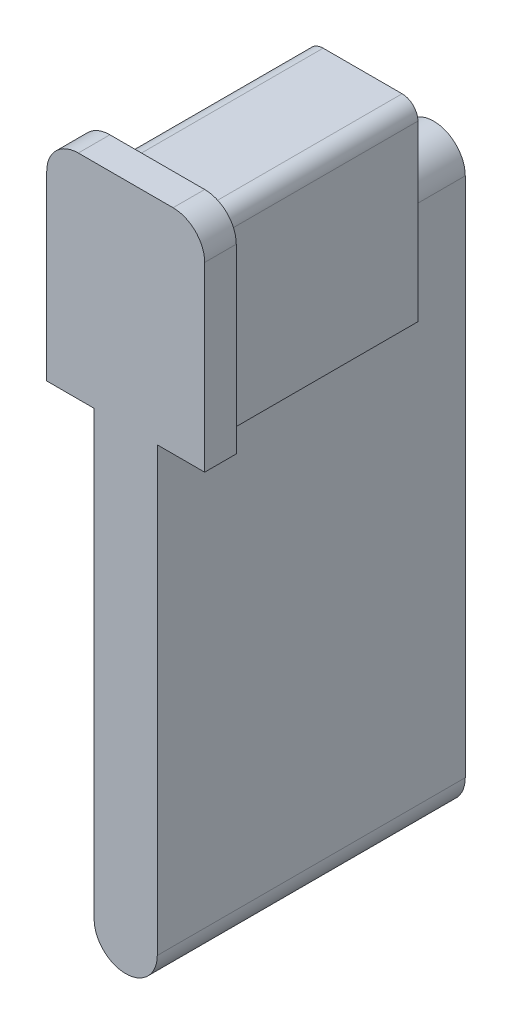
ISO-10303-21;
HEADER;
FILE_DESCRIPTION(('STEP AP214'),'2;1');
FILE_NAME('part.step','',(''),(''),'','','');
FILE_SCHEMA(('AUTOMOTIVE_DESIGN { 1 0 10303 214 1 1 1 1 }'));
ENDSEC;
DATA;
#1=APPLICATION_CONTEXT('core data for automotive mechanical design processes');
#2=APPLICATION_PROTOCOL_DEFINITION('international standard','automotive_design',2000,#1);
#3=PRODUCT_CONTEXT('',#1,'mechanical');
#4=PRODUCT('Part','Part','',(#3));
#5=PRODUCT_RELATED_PRODUCT_CATEGORY('part','',(#4));
#6=PRODUCT_DEFINITION_FORMATION('','',#4);
#7=PRODUCT_DEFINITION_CONTEXT('part definition',#1,'design');
#8=PRODUCT_DEFINITION('design','',#6,#7);
#9=PRODUCT_DEFINITION_SHAPE('','',#8);
#10=(LENGTH_UNIT() NAMED_UNIT(*) SI_UNIT(.MILLI.,.METRE.));
#11=(NAMED_UNIT(*) PLANE_ANGLE_UNIT() SI_UNIT($,.RADIAN.));
#12=(NAMED_UNIT(*) SI_UNIT($,.STERADIAN.) SOLID_ANGLE_UNIT());
#13=UNCERTAINTY_MEASURE_WITH_UNIT(LENGTH_MEASURE(1.E-05),#10,'distance_accuracy_value','');
#14=(GEOMETRIC_REPRESENTATION_CONTEXT(3) GLOBAL_UNCERTAINTY_ASSIGNED_CONTEXT((#13)) GLOBAL_UNIT_ASSIGNED_CONTEXT((#10,
#11,#12)) REPRESENTATION_CONTEXT('',''));
#15=CARTESIAN_POINT('',(0.,0.,0.));
#16=DIRECTION('',(0.,0.,1.));
#17=DIRECTION('',(1.,0.,0.));
#18=AXIS2_PLACEMENT_3D('',#15,#16,#17);
#19=CARTESIAN_POINT('',(-1.5,40.,4.5));
#20=DIRECTION('',(-1.,0.,0.));
#21=DIRECTION('',(0.,0.,1.));
#22=AXIS2_PLACEMENT_3D('',#19,#20,#21);
#23=PLANE('',#22);
#24=DIRECTION('',(0.,0.,1.));
#25=VECTOR('',#24,1.);
#26=CARTESIAN_POINT('',(-1.5,28.,4.5));
#27=LINE('',#26,#25);
#28=CARTESIAN_POINT('',(-1.5,28.,4.5));
#29=VERTEX_POINT('',#28);
#30=CARTESIAN_POINT('',(-1.5,28.,17.5));
#31=VERTEX_POINT('',#30);
#32=EDGE_CURVE('E211',#29,#31,#27,.T.);
#33=ORIENTED_EDGE('',*,*,#32,.T.);
#34=DIRECTION('',(0.,1.,0.));
#35=VECTOR('',#34,1.);
#36=CARTESIAN_POINT('',(-1.5,40.,17.5));
#37=LINE('',#36,#35);
#38=CARTESIAN_POINT('',(-1.5,39.,17.5));
#39=VERTEX_POINT('',#38);
#40=EDGE_CURVE('E192',#31,#39,#37,.T.);
#41=ORIENTED_EDGE('',*,*,#40,.T.);
#42=DIRECTION('',(0.,0.,1.));
#43=VECTOR('',#42,1.);
#44=CARTESIAN_POINT('',(-1.5,39.,4.5));
#45=LINE('',#44,#43);
#46=CARTESIAN_POINT('',(-1.5,39.,4.5));
#47=VERTEX_POINT('',#46);
#48=EDGE_CURVE('E268',#39,#47,#45,.F.);
#49=ORIENTED_EDGE('',*,*,#48,.T.);
#50=DIRECTION('',(0.,-1.,0.));
#51=VECTOR('',#50,1.);
#52=CARTESIAN_POINT('',(-1.5,40.,4.5));
#53=LINE('',#52,#51);
#54=EDGE_CURVE('E176',#47,#29,#53,.T.);
#55=ORIENTED_EDGE('',*,*,#54,.T.);
#56=EDGE_LOOP('',(#33,#41,#49,#55));
#57=FACE_BOUND('',#56,.T.);
#58=ADVANCED_FACE('F33',(#57),#23,.T.);
#59=CARTESIAN_POINT('',(-1.5,40.,4.5));
#60=DIRECTION('',(0.,1.,0.));
#61=DIRECTION('',(0.,0.,1.));
#62=AXIS2_PLACEMENT_3D('',#59,#60,#61);
#63=PLANE('',#62);
#64=DIRECTION('',(0.,0.,1.));
#65=VECTOR('',#64,1.);
#66=CARTESIAN_POINT('',(-0.500000000000002,40.,4.5));
#67=LINE('',#66,#65);
#68=CARTESIAN_POINT('',(-0.500000000000002,40.,4.5));
#69=VERTEX_POINT('',#68);
#70=CARTESIAN_POINT('',(-0.500000000000002,40.,17.5));
#71=VERTEX_POINT('',#70);
#72=EDGE_CURVE('E259',#69,#71,#67,.T.);
#73=ORIENTED_EDGE('',*,*,#72,.T.);
#74=DIRECTION('',(1.,0.,0.));
#75=VECTOR('',#74,1.);
#76=CARTESIAN_POINT('',(-1.5,40.,17.5));
#77=LINE('',#76,#75);
#78=CARTESIAN_POINT('',(4.49999999999999,40.,17.5));
#79=VERTEX_POINT('',#78);
#80=EDGE_CURVE('E185',#71,#79,#77,.T.);
#81=ORIENTED_EDGE('',*,*,#80,.T.);
#82=DIRECTION('',(0.,0.,1.));
#83=VECTOR('',#82,1.);
#84=CARTESIAN_POINT('',(4.49999999999999,40.,4.5));
#85=LINE('',#84,#83);
#86=CARTESIAN_POINT('',(4.49999999999999,40.,4.5));
#87=VERTEX_POINT('',#86);
#88=EDGE_CURVE('E262',#79,#87,#85,.F.);
#89=ORIENTED_EDGE('',*,*,#88,.T.);
#90=DIRECTION('',(-1.,0.,0.));
#91=VECTOR('',#90,1.);
#92=CARTESIAN_POINT('',(-1.5,40.,4.5));
#93=LINE('',#92,#91);
#94=EDGE_CURVE('E208',#87,#69,#93,.T.);
#95=ORIENTED_EDGE('',*,*,#94,.T.);
#96=EDGE_LOOP('',(#73,#81,#89,#95));
#97=FACE_BOUND('',#96,.T.);
#98=ADVANCED_FACE('F322',(#97),#63,.T.);
#99=CARTESIAN_POINT('',(5.49999999999999,40.,4.5));
#100=DIRECTION('',(1.,0.,0.));
#101=DIRECTION('',(0.,0.,-1.));
#102=AXIS2_PLACEMENT_3D('',#99,#100,#101);
#103=PLANE('',#102);
#104=DIRECTION('',(0.,0.,1.));
#105=VECTOR('',#104,1.);
#106=CARTESIAN_POINT('',(5.49999999999999,39.,4.5));
#107=LINE('',#106,#105);
#108=CARTESIAN_POINT('',(5.49999999999999,39.,4.5));
#109=VERTEX_POINT('',#108);
#110=CARTESIAN_POINT('',(5.49999999999999,39.,17.5));
#111=VERTEX_POINT('',#110);
#112=EDGE_CURVE('E256',#109,#111,#107,.T.);
#113=ORIENTED_EDGE('',*,*,#112,.T.);
#114=DIRECTION('',(0.,-1.,0.));
#115=VECTOR('',#114,1.);
#116=CARTESIAN_POINT('',(5.49999999999999,40.,17.5));
#117=LINE('',#116,#115);
#118=CARTESIAN_POINT('',(5.49999999999999,28.,17.5));
#119=VERTEX_POINT('',#118);
#120=EDGE_CURVE('E198',#111,#119,#117,.T.);
#121=ORIENTED_EDGE('',*,*,#120,.T.);
#122=DIRECTION('',(0.,0.,1.));
#123=VECTOR('',#122,1.);
#124=CARTESIAN_POINT('',(5.49999999999999,28.,4.5));
#125=LINE('',#124,#123);
#126=CARTESIAN_POINT('',(5.49999999999999,28.,4.5));
#127=VERTEX_POINT('',#126);
#128=EDGE_CURVE('E212',#127,#119,#125,.T.);
#129=ORIENTED_EDGE('',*,*,#128,.F.);
#130=DIRECTION('',(0.,1.,0.));
#131=VECTOR('',#130,1.);
#132=CARTESIAN_POINT('',(5.49999999999999,40.,4.5));
#133=LINE('',#132,#131);
#134=EDGE_CURVE('E205',#127,#109,#133,.T.);
#135=ORIENTED_EDGE('',*,*,#134,.T.);
#136=EDGE_LOOP('',(#113,#121,#129,#135));
#137=FACE_BOUND('',#136,.T.);
#138=ADVANCED_FACE('F314',(#137),#103,.T.);
#139=CARTESIAN_POINT('',(4.49999999999999,39.,4.5));
#140=DIRECTION('',(0.,0.,1.));
#141=DIRECTION('',(1.,0.,0.));
#142=AXIS2_PLACEMENT_3D('',#139,#140,#141);
#143=CYLINDRICAL_SURFACE('',#142,1.);
#144=ORIENTED_EDGE('',*,*,#88,.F.);
#145=CARTESIAN_POINT('',(4.49999999999999,39.,17.5));
#146=DIRECTION('',(0.,0.,1.));
#147=DIRECTION('',(1.,0.,0.));
#148=AXIS2_PLACEMENT_3D('',#145,#146,#147);
#149=CIRCLE('',#148,1.);
#150=EDGE_CURVE('E195',#79,#111,#149,.F.);
#151=ORIENTED_EDGE('',*,*,#150,.T.);
#152=ORIENTED_EDGE('',*,*,#112,.F.);
#153=CARTESIAN_POINT('',(4.49999999999999,39.,4.5));
#154=DIRECTION('',(0.,0.,1.));
#155=DIRECTION('',(1.,0.,0.));
#156=AXIS2_PLACEMENT_3D('',#153,#154,#155);
#157=CIRCLE('',#156,1.);
#158=EDGE_CURVE('E266',#87,#109,#157,.F.);
#159=ORIENTED_EDGE('',*,*,#158,.F.);
#160=EDGE_LOOP('',(#144,#151,#152,#159));
#161=FACE_BOUND('',#160,.T.);
#162=ADVANCED_FACE('F320',(#161),#143,.T.);
#163=CARTESIAN_POINT('',(-0.500000000000002,39.,4.5));
#164=DIRECTION('',(0.,0.,1.));
#165=DIRECTION('',(1.,0.,0.));
#166=AXIS2_PLACEMENT_3D('',#163,#164,#165);
#167=CYLINDRICAL_SURFACE('',#166,1.);
#168=ORIENTED_EDGE('',*,*,#48,.F.);
#169=CARTESIAN_POINT('',(-0.500000000000002,39.,17.5));
#170=DIRECTION('',(0.,0.,1.));
#171=DIRECTION('',(1.,0.,0.));
#172=AXIS2_PLACEMENT_3D('',#169,#170,#171);
#173=CIRCLE('',#172,1.);
#174=EDGE_CURVE('E270',#39,#71,#173,.F.);
#175=ORIENTED_EDGE('',*,*,#174,.T.);
#176=ORIENTED_EDGE('',*,*,#72,.F.);
#177=CARTESIAN_POINT('',(-0.500000000000002,39.,4.5));
#178=DIRECTION('',(0.,0.,1.));
#179=DIRECTION('',(1.,0.,0.));
#180=AXIS2_PLACEMENT_3D('',#177,#178,#179);
#181=CIRCLE('',#180,1.);
#182=EDGE_CURVE('E264',#47,#69,#181,.F.);
#183=ORIENTED_EDGE('',*,*,#182,.F.);
#184=EDGE_LOOP('',(#168,#175,#176,#183));
#185=FACE_BOUND('',#184,.T.);
#186=ADVANCED_FACE('F328',(#185),#167,.T.);
#187=CARTESIAN_POINT('',(2.,33.,19.5));
#188=DIRECTION('',(0.,0.,-1.));
#189=DIRECTION('',(-1.,0.,0.));
#190=AXIS2_PLACEMENT_3D('',#187,#188,#189);
#191=CYLINDRICAL_SURFACE('',#190,2.);
#192=CARTESIAN_POINT('',(2.,33.,4.5));
#193=DIRECTION('',(0.,0.,1.));
#194=DIRECTION('',(1.,0.,0.));
#195=AXIS2_PLACEMENT_3D('',#192,#193,#194);
#196=CIRCLE('',#195,2.);
#197=CARTESIAN_POINT('',(4.,33.,4.5));
#198=VERTEX_POINT('',#197);
#199=CARTESIAN_POINT('',(0.,33.,4.5));
#200=VERTEX_POINT('',#199);
#201=EDGE_CURVE('E220',#198,#200,#196,.T.);
#202=ORIENTED_EDGE('',*,*,#201,.F.);
#203=DIRECTION('',(0.,0.,-1.));
#204=VECTOR('',#203,1.);
#205=CARTESIAN_POINT('',(4.,33.,19.5));
#206=LINE('',#205,#204);
#207=CARTESIAN_POINT('',(4.,33.,0.));
#208=VERTEX_POINT('',#207);
#209=EDGE_CURVE('E248',#198,#208,#206,.T.);
#210=ORIENTED_EDGE('',*,*,#209,.T.);
#211=CARTESIAN_POINT('',(2.,33.,0.));
#212=DIRECTION('',(0.,0.,1.));
#213=DIRECTION('',(1.,0.,0.));
#214=AXIS2_PLACEMENT_3D('',#211,#212,#213);
#215=CIRCLE('',#214,2.);
#216=CARTESIAN_POINT('',(0.,33.,0.));
#217=VERTEX_POINT('',#216);
#218=EDGE_CURVE('E230',#208,#217,#215,.T.);
#219=ORIENTED_EDGE('',*,*,#218,.T.);
#220=DIRECTION('',(0.,0.,-1.));
#221=VECTOR('',#220,1.);
#222=CARTESIAN_POINT('',(0.,33.,19.5));
#223=LINE('',#222,#221);
#224=EDGE_CURVE('E246',#200,#217,#223,.T.);
#225=ORIENTED_EDGE('',*,*,#224,.F.);
#226=EDGE_LOOP('',(#202,#210,#219,#225));
#227=FACE_BOUND('',#226,.T.);
#228=ADVANCED_FACE('F340',(#227),#191,.T.);
#229=CARTESIAN_POINT('',(2.,0.,19.5));
#230=DIRECTION('',(0.,0.,-1.));
#231=DIRECTION('',(-1.,0.,0.));
#232=AXIS2_PLACEMENT_3D('',#229,#230,#231);
#233=CYLINDRICAL_SURFACE('',#232,2.);
#234=CARTESIAN_POINT('',(2.,0.,0.));
#235=DIRECTION('',(0.,0.,1.));
#236=DIRECTION('',(1.,0.,0.));
#237=AXIS2_PLACEMENT_3D('',#234,#235,#236);
#238=CIRCLE('',#237,2.);
#239=CARTESIAN_POINT('',(0.,0.,0.));
#240=VERTEX_POINT('',#239);
#241=CARTESIAN_POINT('',(4.,0.,0.));
#242=VERTEX_POINT('',#241);
#243=EDGE_CURVE('E224',#240,#242,#238,.T.);
#244=ORIENTED_EDGE('',*,*,#243,.T.);
#245=DIRECTION('',(0.,0.,-1.));
#246=VECTOR('',#245,1.);
#247=CARTESIAN_POINT('',(4.,0.,19.5));
#248=LINE('',#247,#246);
#249=CARTESIAN_POINT('',(4.,0.,19.5));
#250=VERTEX_POINT('',#249);
#251=EDGE_CURVE('E250',#250,#242,#248,.T.);
#252=ORIENTED_EDGE('',*,*,#251,.F.);
#253=CARTESIAN_POINT('',(2.,0.,19.5));
#254=DIRECTION('',(0.,0.,1.));
#255=DIRECTION('',(1.,0.,0.));
#256=AXIS2_PLACEMENT_3D('',#253,#254,#255);
#257=CIRCLE('',#256,2.);
#258=CARTESIAN_POINT('',(0.,0.,19.5));
#259=VERTEX_POINT('',#258);
#260=EDGE_CURVE('E235',#259,#250,#257,.T.);
#261=ORIENTED_EDGE('',*,*,#260,.F.);
#262=DIRECTION('',(0.,0.,-1.));
#263=VECTOR('',#262,1.);
#264=CARTESIAN_POINT('',(0.,0.,19.5));
#265=LINE('',#264,#263);
#266=EDGE_CURVE('E243',#259,#240,#265,.T.);
#267=ORIENTED_EDGE('',*,*,#266,.T.);
#268=EDGE_LOOP('',(#244,#252,#261,#267));
#269=FACE_BOUND('',#268,.T.);
#270=ADVANCED_FACE('F35',(#269),#233,.T.);
#271=CARTESIAN_POINT('',(4.,0.,19.5));
#272=DIRECTION('',(-1.,0.,0.));
#273=DIRECTION('',(0.,0.,1.));
#274=AXIS2_PLACEMENT_3D('',#271,#272,#273);
#275=PLANE('',#274);
#276=DIRECTION('',(0.,1.,0.));
#277=VECTOR('',#276,1.);
#278=CARTESIAN_POINT('',(4.,0.,4.5));
#279=LINE('',#278,#277);
#280=CARTESIAN_POINT('',(4.,28.,4.5));
#281=VERTEX_POINT('',#280);
#282=EDGE_CURVE('E222',#281,#198,#279,.T.);
#283=ORIENTED_EDGE('',*,*,#282,.F.);
#284=DIRECTION('',(0.,0.,1.));
#285=VECTOR('',#284,1.);
#286=CARTESIAN_POINT('',(4.,28.,19.5));
#287=LINE('',#286,#285);
#288=CARTESIAN_POINT('',(4.,28.,19.5));
#289=VERTEX_POINT('',#288);
#290=EDGE_CURVE('E218',#281,#289,#287,.T.);
#291=ORIENTED_EDGE('',*,*,#290,.T.);
#292=DIRECTION('',(0.,1.,0.));
#293=VECTOR('',#292,1.);
#294=CARTESIAN_POINT('',(4.,0.,19.5));
#295=LINE('',#294,#293);
#296=EDGE_CURVE('E238',#250,#289,#295,.T.);
#297=ORIENTED_EDGE('',*,*,#296,.F.);
#298=ORIENTED_EDGE('',*,*,#251,.T.);
#299=DIRECTION('',(0.,1.,0.));
#300=VECTOR('',#299,1.);
#301=CARTESIAN_POINT('',(4.,0.,0.));
#302=LINE('',#301,#300);
#303=EDGE_CURVE('E227',#242,#208,#302,.T.);
#304=ORIENTED_EDGE('',*,*,#303,.T.);
#305=ORIENTED_EDGE('',*,*,#209,.F.);
#306=EDGE_LOOP('',(#283,#291,#297,#298,#304,#305));
#307=FACE_BOUND('',#306,.T.);
#308=ADVANCED_FACE('F353',(#307),#275,.F.);
#309=CARTESIAN_POINT('',(0.,0.,19.5));
#310=DIRECTION('',(1.,0.,0.));
#311=DIRECTION('',(0.,0.,-1.));
#312=AXIS2_PLACEMENT_3D('',#309,#310,#311);
#313=PLANE('',#312);
#314=DIRECTION('',(0.,-1.,0.));
#315=VECTOR('',#314,1.);
#316=CARTESIAN_POINT('',(0.,0.,19.5));
#317=LINE('',#316,#315);
#318=CARTESIAN_POINT('',(0.,28.,19.5));
#319=VERTEX_POINT('',#318);
#320=EDGE_CURVE('E241',#319,#259,#317,.T.);
#321=ORIENTED_EDGE('',*,*,#320,.F.);
#322=DIRECTION('',(0.,0.,-1.));
#323=VECTOR('',#322,1.);
#324=CARTESIAN_POINT('',(0.,28.,19.5));
#325=LINE('',#324,#323);
#326=CARTESIAN_POINT('',(0.,28.,4.5));
#327=VERTEX_POINT('',#326);
#328=EDGE_CURVE('E174',#319,#327,#325,.T.);
#329=ORIENTED_EDGE('',*,*,#328,.T.);
#330=DIRECTION('',(0.,-1.,0.));
#331=VECTOR('',#330,1.);
#332=CARTESIAN_POINT('',(0.,0.,4.5));
#333=LINE('',#332,#331);
#334=EDGE_CURVE('E253',#200,#327,#333,.T.);
#335=ORIENTED_EDGE('',*,*,#334,.F.);
#336=ORIENTED_EDGE('',*,*,#224,.T.);
#337=DIRECTION('',(0.,-1.,0.));
#338=VECTOR('',#337,1.);
#339=CARTESIAN_POINT('',(0.,0.,0.));
#340=LINE('',#339,#338);
#341=EDGE_CURVE('E233',#217,#240,#340,.T.);
#342=ORIENTED_EDGE('',*,*,#341,.T.);
#343=ORIENTED_EDGE('',*,*,#266,.F.);
#344=EDGE_LOOP('',(#321,#329,#335,#336,#342,#343));
#345=FACE_BOUND('',#344,.T.);
#346=ADVANCED_FACE('F338',(#345),#313,.F.);
#347=CARTESIAN_POINT('',(2.,0.,19.5));
#348=DIRECTION('',(0.,0.,1.));
#349=DIRECTION('',(1.,0.,0.));
#350=AXIS2_PLACEMENT_3D('',#347,#348,#349);
#351=PLANE('',#350);
#352=DIRECTION('',(0.,1.,0.));
#353=VECTOR('',#352,1.);
#354=CARTESIAN_POINT('',(7.,41.5,19.5));
#355=LINE('',#354,#353);
#356=CARTESIAN_POINT('',(7.,28.,19.5));
#357=VERTEX_POINT('',#356);
#358=CARTESIAN_POINT('',(7.,39.5,19.5));
#359=VERTEX_POINT('',#358);
#360=EDGE_CURVE('E165',#357,#359,#355,.T.);
#361=ORIENTED_EDGE('',*,*,#360,.T.);
#362=CARTESIAN_POINT('',(5.,39.5,19.5));
#363=DIRECTION('',(0.,0.,1.));
#364=DIRECTION('',(1.,0.,0.));
#365=AXIS2_PLACEMENT_3D('',#362,#363,#364);
#366=CIRCLE('',#365,2.);
#367=CARTESIAN_POINT('',(5.,41.5,19.5));
#368=VERTEX_POINT('',#367);
#369=EDGE_CURVE('E277',#359,#368,#366,.T.);
#370=ORIENTED_EDGE('',*,*,#369,.T.);
#371=DIRECTION('',(-1.,0.,0.));
#372=VECTOR('',#371,1.);
#373=CARTESIAN_POINT('',(-3.,41.5,19.5));
#374=LINE('',#373,#372);
#375=CARTESIAN_POINT('',(-1.,41.5,19.5));
#376=VERTEX_POINT('',#375);
#377=EDGE_CURVE('E299',#368,#376,#374,.T.);
#378=ORIENTED_EDGE('',*,*,#377,.T.);
#379=CARTESIAN_POINT('',(-1.,39.5,19.5));
#380=DIRECTION('',(0.,0.,1.));
#381=DIRECTION('',(1.,0.,0.));
#382=AXIS2_PLACEMENT_3D('',#379,#380,#381);
#383=CIRCLE('',#382,2.);
#384=CARTESIAN_POINT('',(-3.,39.5,19.5));
#385=VERTEX_POINT('',#384);
#386=EDGE_CURVE('E163',#376,#385,#383,.T.);
#387=ORIENTED_EDGE('',*,*,#386,.T.);
#388=DIRECTION('',(0.,-1.,0.));
#389=VECTOR('',#388,1.);
#390=CARTESIAN_POINT('',(-3.,41.5,19.5));
#391=LINE('',#390,#389);
#392=CARTESIAN_POINT('',(-3.,28.,19.5));
#393=VERTEX_POINT('',#392);
#394=EDGE_CURVE('E156',#385,#393,#391,.T.);
#395=ORIENTED_EDGE('',*,*,#394,.T.);
#396=DIRECTION('',(1.,0.,0.));
#397=VECTOR('',#396,1.);
#398=CARTESIAN_POINT('',(-1.5,28.,19.5));
#399=LINE('',#398,#397);
#400=EDGE_CURVE('E160',#393,#319,#399,.T.);
#401=ORIENTED_EDGE('',*,*,#400,.T.);
#402=ORIENTED_EDGE('',*,*,#320,.T.);
#403=ORIENTED_EDGE('',*,*,#260,.T.);
#404=ORIENTED_EDGE('',*,*,#296,.T.);
#405=EDGE_CURVE('E177',#289,#357,#399,.T.);
#406=ORIENTED_EDGE('',*,*,#405,.T.);
#407=EDGE_LOOP('',(#361,#370,#378,#387,#395,#401,#402,#403,#404,#406));
#408=FACE_BOUND('',#407,.T.);
#409=ADVANCED_FACE('F159',(#408),#351,.T.);
#410=CARTESIAN_POINT('',(2.,0.,0.));
#411=DIRECTION('',(0.,0.,1.));
#412=DIRECTION('',(1.,0.,0.));
#413=AXIS2_PLACEMENT_3D('',#410,#411,#412);
#414=PLANE('',#413);
#415=ORIENTED_EDGE('',*,*,#243,.F.);
#416=ORIENTED_EDGE('',*,*,#341,.F.);
#417=ORIENTED_EDGE('',*,*,#218,.F.);
#418=ORIENTED_EDGE('',*,*,#303,.F.);
#419=EDGE_LOOP('',(#415,#416,#417,#418));
#420=FACE_BOUND('',#419,.T.);
#421=ADVANCED_FACE('F346',(#420),#414,.F.);
#422=CARTESIAN_POINT('',(-1.5,28.,4.5));
#423=DIRECTION('',(0.,0.,1.));
#424=DIRECTION('',(1.,0.,0.));
#425=AXIS2_PLACEMENT_3D('',#422,#423,#424);
#426=PLANE('',#425);
#427=ORIENTED_EDGE('',*,*,#94,.F.);
#428=ORIENTED_EDGE('',*,*,#158,.T.);
#429=ORIENTED_EDGE('',*,*,#134,.F.);
#430=DIRECTION('',(1.,0.,0.));
#431=VECTOR('',#430,1.);
#432=CARTESIAN_POINT('',(-1.5,28.,4.5));
#433=LINE('',#432,#431);
#434=EDGE_CURVE('E202',#281,#127,#433,.T.);
#435=ORIENTED_EDGE('',*,*,#434,.F.);
#436=ORIENTED_EDGE('',*,*,#282,.T.);
#437=ORIENTED_EDGE('',*,*,#201,.T.);
#438=ORIENTED_EDGE('',*,*,#334,.T.);
#439=EDGE_CURVE('E203',#29,#327,#433,.T.);
#440=ORIENTED_EDGE('',*,*,#439,.F.);
#441=ORIENTED_EDGE('',*,*,#54,.F.);
#442=ORIENTED_EDGE('',*,*,#182,.T.);
#443=EDGE_LOOP('',(#427,#428,#429,#435,#436,#437,#438,#440,#441,#442));
#444=FACE_BOUND('',#443,.T.);
#445=ADVANCED_FACE('F333',(#444),#426,.F.);
#446=CARTESIAN_POINT('',(-1.5,28.,4.5));
#447=DIRECTION('',(0.,-1.,0.));
#448=DIRECTION('',(0.,0.,-1.));
#449=AXIS2_PLACEMENT_3D('',#446,#447,#448);
#450=PLANE('',#449);
#451=ORIENTED_EDGE('',*,*,#405,.F.);
#452=ORIENTED_EDGE('',*,*,#290,.F.);
#453=ORIENTED_EDGE('',*,*,#434,.T.);
#454=ORIENTED_EDGE('',*,*,#128,.T.);
#455=DIRECTION('',(1.,0.,0.));
#456=VECTOR('',#455,1.);
#457=CARTESIAN_POINT('',(-3.,28.,17.5));
#458=LINE('',#457,#456);
#459=CARTESIAN_POINT('',(7.,28.,17.5));
#460=VERTEX_POINT('',#459);
#461=EDGE_CURVE('E304',#119,#460,#458,.T.);
#462=ORIENTED_EDGE('',*,*,#461,.T.);
#463=DIRECTION('',(0.,0.,1.));
#464=VECTOR('',#463,1.);
#465=CARTESIAN_POINT('',(7.,28.,17.5));
#466=LINE('',#465,#464);
#467=EDGE_CURVE('E181',#460,#357,#466,.T.);
#468=ORIENTED_EDGE('',*,*,#467,.T.);
#469=EDGE_LOOP('',(#451,#452,#453,#454,#462,#468));
#470=FACE_BOUND('',#469,.T.);
#471=ADVANCED_FACE('F311',(#470),#450,.T.);
#472=CARTESIAN_POINT('',(-3.,28.,17.5));
#473=VERTEX_POINT('',#472);
#474=EDGE_CURVE('E295',#473,#31,#458,.T.);
#475=ORIENTED_EDGE('',*,*,#474,.T.);
#476=ORIENTED_EDGE('',*,*,#32,.F.);
#477=ORIENTED_EDGE('',*,*,#439,.T.);
#478=ORIENTED_EDGE('',*,*,#328,.F.);
#479=ORIENTED_EDGE('',*,*,#400,.F.);
#480=DIRECTION('',(0.,0.,1.));
#481=VECTOR('',#480,1.);
#482=CARTESIAN_POINT('',(-3.,28.,17.5));
#483=LINE('',#482,#481);
#484=EDGE_CURVE('E171',#473,#393,#483,.T.);
#485=ORIENTED_EDGE('',*,*,#484,.F.);
#486=EDGE_LOOP('',(#475,#476,#477,#478,#479,#485));
#487=FACE_BOUND('',#486,.T.);
#488=ADVANCED_FACE('F170',(#487),#450,.T.);
#489=CARTESIAN_POINT('',(-3.,41.5,17.5));
#490=DIRECTION('',(-1.,0.,0.));
#491=DIRECTION('',(0.,0.,1.));
#492=AXIS2_PLACEMENT_3D('',#489,#490,#491);
#493=PLANE('',#492);
#494=ORIENTED_EDGE('',*,*,#394,.F.);
#495=DIRECTION('',(0.,0.,1.));
#496=VECTOR('',#495,1.);
#497=CARTESIAN_POINT('',(-3.,39.5,17.5));
#498=LINE('',#497,#496);
#499=CARTESIAN_POINT('',(-3.,39.5,17.5));
#500=VERTEX_POINT('',#499);
#501=EDGE_CURVE('E11',#385,#500,#498,.F.);
#502=ORIENTED_EDGE('',*,*,#501,.T.);
#503=DIRECTION('',(0.,-1.,0.));
#504=VECTOR('',#503,1.);
#505=CARTESIAN_POINT('',(-3.,41.5,17.5));
#506=LINE('',#505,#504);
#507=EDGE_CURVE('E180',#500,#473,#506,.T.);
#508=ORIENTED_EDGE('',*,*,#507,.T.);
#509=ORIENTED_EDGE('',*,*,#484,.T.);
#510=EDGE_LOOP('',(#494,#502,#508,#509));
#511=FACE_BOUND('',#510,.T.);
#512=ADVANCED_FACE('F179',(#511),#493,.T.);
#513=CARTESIAN_POINT('',(-3.,41.5,17.5));
#514=DIRECTION('',(0.,1.,0.));
#515=DIRECTION('',(0.,0.,1.));
#516=AXIS2_PLACEMENT_3D('',#513,#514,#515);
#517=PLANE('',#516);
#518=ORIENTED_EDGE('',*,*,#377,.F.);
#519=DIRECTION('',(0.,0.,1.));
#520=VECTOR('',#519,1.);
#521=CARTESIAN_POINT('',(5.,41.5,17.5));
#522=LINE('',#521,#520);
#523=CARTESIAN_POINT('',(5.,41.5,17.5));
#524=VERTEX_POINT('',#523);
#525=EDGE_CURVE('E282',#368,#524,#522,.F.);
#526=ORIENTED_EDGE('',*,*,#525,.T.);
#527=DIRECTION('',(-1.,0.,0.));
#528=VECTOR('',#527,1.);
#529=CARTESIAN_POINT('',(-3.,41.5,17.5));
#530=LINE('',#529,#528);
#531=CARTESIAN_POINT('',(-1.,41.5,17.5));
#532=VERTEX_POINT('',#531);
#533=EDGE_CURVE('E182',#524,#532,#530,.T.);
#534=ORIENTED_EDGE('',*,*,#533,.T.);
#535=DIRECTION('',(0.,0.,1.));
#536=VECTOR('',#535,1.);
#537=CARTESIAN_POINT('',(-1.,41.5,17.5));
#538=LINE('',#537,#536);
#539=EDGE_CURVE('E279',#532,#376,#538,.T.);
#540=ORIENTED_EDGE('',*,*,#539,.T.);
#541=EDGE_LOOP('',(#518,#526,#534,#540));
#542=FACE_BOUND('',#541,.T.);
#543=ADVANCED_FACE('F301',(#542),#517,.T.);
#544=CARTESIAN_POINT('',(7.,41.5,17.5));
#545=DIRECTION('',(1.,0.,0.));
#546=DIRECTION('',(0.,0.,-1.));
#547=AXIS2_PLACEMENT_3D('',#544,#545,#546);
#548=PLANE('',#547);
#549=DIRECTION('',(0.,1.,0.));
#550=VECTOR('',#549,1.);
#551=CARTESIAN_POINT('',(7.,41.5,17.5));
#552=LINE('',#551,#550);
#553=CARTESIAN_POINT('',(7.,39.5,17.5));
#554=VERTEX_POINT('',#553);
#555=EDGE_CURVE('E187',#460,#554,#552,.T.);
#556=ORIENTED_EDGE('',*,*,#555,.T.);
#557=DIRECTION('',(0.,0.,1.));
#558=VECTOR('',#557,1.);
#559=CARTESIAN_POINT('',(7.,39.5,17.5));
#560=LINE('',#559,#558);
#561=EDGE_CURVE('E273',#554,#359,#560,.T.);
#562=ORIENTED_EDGE('',*,*,#561,.T.);
#563=ORIENTED_EDGE('',*,*,#360,.F.);
#564=ORIENTED_EDGE('',*,*,#467,.F.);
#565=EDGE_LOOP('',(#556,#562,#563,#564));
#566=FACE_BOUND('',#565,.T.);
#567=ADVANCED_FACE('F293',(#566),#548,.T.);
#568=CARTESIAN_POINT('',(-3.,28.,17.5));
#569=DIRECTION('',(0.,0.,1.));
#570=DIRECTION('',(1.,0.,0.));
#571=AXIS2_PLACEMENT_3D('',#568,#569,#570);
#572=PLANE('',#571);
#573=ORIENTED_EDGE('',*,*,#533,.F.);
#574=CARTESIAN_POINT('',(5.,39.5,17.5));
#575=DIRECTION('',(0.,0.,1.));
#576=DIRECTION('',(1.,0.,0.));
#577=AXIS2_PLACEMENT_3D('',#574,#575,#576);
#578=CIRCLE('',#577,2.);
#579=EDGE_CURVE('E41',#524,#554,#578,.F.);
#580=ORIENTED_EDGE('',*,*,#579,.T.);
#581=ORIENTED_EDGE('',*,*,#555,.F.);
#582=ORIENTED_EDGE('',*,*,#461,.F.);
#583=ORIENTED_EDGE('',*,*,#120,.F.);
#584=ORIENTED_EDGE('',*,*,#150,.F.);
#585=ORIENTED_EDGE('',*,*,#80,.F.);
#586=ORIENTED_EDGE('',*,*,#174,.F.);
#587=ORIENTED_EDGE('',*,*,#40,.F.);
#588=ORIENTED_EDGE('',*,*,#474,.F.);
#589=ORIENTED_EDGE('',*,*,#507,.F.);
#590=CARTESIAN_POINT('',(-1.,39.5,17.5));
#591=DIRECTION('',(0.,0.,1.));
#592=DIRECTION('',(1.,0.,0.));
#593=AXIS2_PLACEMENT_3D('',#590,#591,#592);
#594=CIRCLE('',#593,2.);
#595=EDGE_CURVE('E53',#500,#532,#594,.F.);
#596=ORIENTED_EDGE('',*,*,#595,.T.);
#597=EDGE_LOOP('',(#573,#580,#581,#582,#583,#584,#585,#586,#587,#588,#589,#596));
#598=FACE_BOUND('',#597,.T.);
#599=ADVANCED_FACE('F287',(#598),#572,.F.);
#600=CARTESIAN_POINT('',(5.,39.5,17.5));
#601=DIRECTION('',(0.,0.,1.));
#602=DIRECTION('',(1.,0.,0.));
#603=AXIS2_PLACEMENT_3D('',#600,#601,#602);
#604=CYLINDRICAL_SURFACE('',#603,2.);
#605=ORIENTED_EDGE('',*,*,#579,.F.);
#606=ORIENTED_EDGE('',*,*,#525,.F.);
#607=ORIENTED_EDGE('',*,*,#369,.F.);
#608=ORIENTED_EDGE('',*,*,#561,.F.);
#609=EDGE_LOOP('',(#605,#606,#607,#608));
#610=FACE_BOUND('',#609,.T.);
#611=ADVANCED_FACE('F297',(#610),#604,.T.);
#612=CARTESIAN_POINT('',(-1.,39.5,17.5));
#613=DIRECTION('',(0.,0.,1.));
#614=DIRECTION('',(1.,0.,0.));
#615=AXIS2_PLACEMENT_3D('',#612,#613,#614);
#616=CYLINDRICAL_SURFACE('',#615,2.);
#617=ORIENTED_EDGE('',*,*,#595,.F.);
#618=ORIENTED_EDGE('',*,*,#501,.F.);
#619=ORIENTED_EDGE('',*,*,#386,.F.);
#620=ORIENTED_EDGE('',*,*,#539,.F.);
#621=EDGE_LOOP('',(#617,#618,#619,#620));
#622=FACE_BOUND('',#621,.T.);
#623=ADVANCED_FACE('F496',(#622),#616,.T.);
#624=CLOSED_SHELL('',(#58,#98,#138,#162,#186,#228,#270,#308,#346,#409,#421,#445,#471,#488,#512,
#543,#567,#599,#611,#623));
#625=MANIFOLD_SOLID_BREP('B2',#624);
#626=ADVANCED_BREP_SHAPE_REPRESENTATION('',(#18,#625),#14);
#627=SHAPE_DEFINITION_REPRESENTATION(#9,#626);
ENDSEC;
END-ISO-10303-21;
